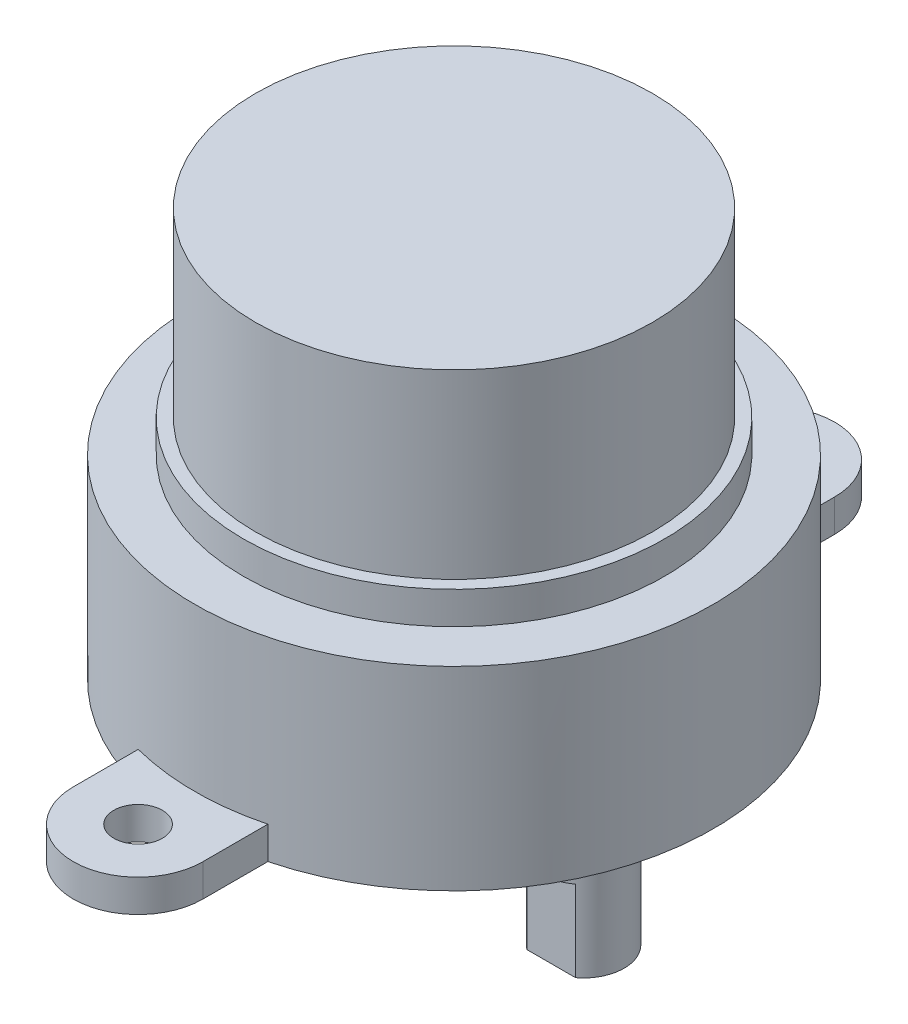
ISO-10303-21;
HEADER;
FILE_DESCRIPTION(('STEP AP214'),'2;1');
FILE_NAME('part.step','',(''),(''),'','','');
FILE_SCHEMA(('AUTOMOTIVE_DESIGN { 1 0 10303 214 1 1 1 1 }'));
ENDSEC;
DATA;
#1=APPLICATION_CONTEXT('core data for automotive mechanical design processes');
#2=APPLICATION_PROTOCOL_DEFINITION('international standard','automotive_design',2000,#1);
#3=PRODUCT_CONTEXT('',#1,'mechanical');
#4=PRODUCT('Part','Part','',(#3));
#5=PRODUCT_RELATED_PRODUCT_CATEGORY('part','',(#4));
#6=PRODUCT_DEFINITION_FORMATION('','',#4);
#7=PRODUCT_DEFINITION_CONTEXT('part definition',#1,'design');
#8=PRODUCT_DEFINITION('design','',#6,#7);
#9=PRODUCT_DEFINITION_SHAPE('','',#8);
#10=(LENGTH_UNIT() NAMED_UNIT(*) SI_UNIT(.MILLI.,.METRE.));
#11=(NAMED_UNIT(*) PLANE_ANGLE_UNIT() SI_UNIT($,.RADIAN.));
#12=(NAMED_UNIT(*) SI_UNIT($,.STERADIAN.) SOLID_ANGLE_UNIT());
#13=UNCERTAINTY_MEASURE_WITH_UNIT(LENGTH_MEASURE(1.E-05),#10,'distance_accuracy_value','');
#14=(GEOMETRIC_REPRESENTATION_CONTEXT(3) GLOBAL_UNCERTAINTY_ASSIGNED_CONTEXT((#13)) GLOBAL_UNIT_ASSIGNED_CONTEXT((#10,
#11,#12)) REPRESENTATION_CONTEXT('',''));
#15=CARTESIAN_POINT('',(0.,0.,0.));
#16=DIRECTION('',(0.,0.,1.));
#17=DIRECTION('',(1.,0.,0.));
#18=AXIS2_PLACEMENT_3D('',#15,#16,#17);
#19=CARTESIAN_POINT('',(8.,-10.2,0.));
#20=DIRECTION('',(0.,-1.,0.));
#21=DIRECTION('',(0.,0.,-1.));
#22=AXIS2_PLACEMENT_3D('',#19,#20,#21);
#23=CYLINDRICAL_SURFACE('',#22,2.5);
#24=CARTESIAN_POINT('',(8.,-2.7,0.));
#25=DIRECTION('',(0.,-1.,0.));
#26=DIRECTION('',(0.,0.,-1.));
#27=AXIS2_PLACEMENT_3D('',#24,#25,#26);
#28=CIRCLE('',#27,2.5);
#29=CARTESIAN_POINT('',(8.,-2.7,-2.5));
#30=VERTEX_POINT('',#29);
#31=EDGE_CURVE('E224',#30,#30,#28,.T.);
#32=ORIENTED_EDGE('',*,*,#31,.T.);
#33=EDGE_LOOP('',(#32));
#34=FACE_BOUND('',#33,.T.);
#35=DIRECTION('',(0.,-1.,0.));
#36=VECTOR('',#35,1.);
#37=CARTESIAN_POINT('',(6.5,-10.2,2.));
#38=LINE('',#37,#36);
#39=CARTESIAN_POINT('',(6.5,-10.2,2.));
#40=VERTEX_POINT('',#39);
#41=CARTESIAN_POINT('',(6.5,-5.2,2.));
#42=VERTEX_POINT('',#41);
#43=EDGE_CURVE('E189',#40,#42,#38,.F.);
#44=ORIENTED_EDGE('',*,*,#43,.T.);
#45=CARTESIAN_POINT('',(8.,-5.2,0.));
#46=DIRECTION('',(0.,1.,0.));
#47=DIRECTION('',(0.,0.,1.));
#48=AXIS2_PLACEMENT_3D('',#45,#46,#47);
#49=CIRCLE('',#48,2.5);
#50=CARTESIAN_POINT('',(9.5,-5.2,2.));
#51=VERTEX_POINT('',#50);
#52=EDGE_CURVE('E195',#51,#42,#49,.F.);
#53=ORIENTED_EDGE('',*,*,#52,.F.);
#54=DIRECTION('',(0.,-1.,0.));
#55=VECTOR('',#54,1.);
#56=CARTESIAN_POINT('',(9.5,-10.2,2.));
#57=LINE('',#56,#55);
#58=CARTESIAN_POINT('',(9.5,-10.2,2.));
#59=VERTEX_POINT('',#58);
#60=EDGE_CURVE('E186',#51,#59,#57,.T.);
#61=ORIENTED_EDGE('',*,*,#60,.T.);
#62=CARTESIAN_POINT('',(8.,-10.2,0.));
#63=DIRECTION('',(0.,-1.,0.));
#64=DIRECTION('',(0.,0.,-1.));
#65=AXIS2_PLACEMENT_3D('',#62,#63,#64);
#66=CIRCLE('',#65,2.5);
#67=CARTESIAN_POINT('',(9.5,-10.2,-2.));
#68=VERTEX_POINT('',#67);
#69=EDGE_CURVE('E221',#68,#59,#66,.T.);
#70=ORIENTED_EDGE('',*,*,#69,.F.);
#71=DIRECTION('',(0.,-1.,0.));
#72=VECTOR('',#71,1.);
#73=CARTESIAN_POINT('',(9.5,-10.2,-2.));
#74=LINE('',#73,#72);
#75=CARTESIAN_POINT('',(9.5,-5.2,-2.));
#76=VERTEX_POINT('',#75);
#77=EDGE_CURVE('E190',#76,#68,#74,.T.);
#78=ORIENTED_EDGE('',*,*,#77,.F.);
#79=CARTESIAN_POINT('',(8.,-5.2,0.));
#80=DIRECTION('',(0.,1.,0.));
#81=DIRECTION('',(0.,0.,1.));
#82=AXIS2_PLACEMENT_3D('',#79,#80,#81);
#83=CIRCLE('',#82,2.5);
#84=CARTESIAN_POINT('',(6.5,-5.2,-2.));
#85=VERTEX_POINT('',#84);
#86=EDGE_CURVE('E203',#85,#76,#83,.F.);
#87=ORIENTED_EDGE('',*,*,#86,.F.);
#88=DIRECTION('',(0.,-1.,0.));
#89=VECTOR('',#88,1.);
#90=CARTESIAN_POINT('',(6.5,-10.2,-2.));
#91=LINE('',#90,#89);
#92=CARTESIAN_POINT('',(6.5,-10.2,-2.));
#93=VERTEX_POINT('',#92);
#94=EDGE_CURVE('E208',#93,#85,#91,.F.);
#95=ORIENTED_EDGE('',*,*,#94,.F.);
#96=EDGE_CURVE('E220',#40,#93,#66,.T.);
#97=ORIENTED_EDGE('',*,*,#96,.F.);
#98=EDGE_LOOP('',(#44,#53,#61,#70,#78,#87,#95,#97));
#99=FACE_BOUND('',#98,.T.);
#100=ADVANCED_FACE('F42',(#34,#99),#23,.T.);
#101=CARTESIAN_POINT('',(5.5,-10.2,0.));
#102=DIRECTION('',(0.,1.,0.));
#103=DIRECTION('',(0.,0.,1.));
#104=AXIS2_PLACEMENT_3D('',#101,#102,#103);
#105=PLANE('',#104);
#106=CARTESIAN_POINT('',(8.,-10.2,0.));
#107=DIRECTION('',(0.,-1.,0.));
#108=DIRECTION('',(0.,0.,-1.));
#109=AXIS2_PLACEMENT_3D('',#106,#107,#108);
#110=CIRCLE('',#109,1.525);
#111=CARTESIAN_POINT('',(8.,-10.2,-1.525));
#112=VERTEX_POINT('',#111);
#113=EDGE_CURVE('E201',#112,#112,#110,.T.);
#114=ORIENTED_EDGE('',*,*,#113,.F.);
#115=EDGE_LOOP('',(#114));
#116=FACE_BOUND('',#115,.T.);
#117=DIRECTION('',(-1.,0.,0.));
#118=VECTOR('',#117,1.);
#119=CARTESIAN_POINT('',(3.28976687585963,-10.2,2.));
#120=LINE('',#119,#118);
#121=EDGE_CURVE('E198',#59,#40,#120,.T.);
#122=ORIENTED_EDGE('',*,*,#121,.T.);
#123=ORIENTED_EDGE('',*,*,#96,.T.);
#124=DIRECTION('',(-1.,0.,0.));
#125=VECTOR('',#124,1.);
#126=CARTESIAN_POINT('',(3.57834291760171,-10.2,-2.));
#127=LINE('',#126,#125);
#128=EDGE_CURVE('E181',#68,#93,#127,.T.);
#129=ORIENTED_EDGE('',*,*,#128,.F.);
#130=ORIENTED_EDGE('',*,*,#69,.T.);
#131=EDGE_LOOP('',(#122,#123,#129,#130));
#132=FACE_BOUND('',#131,.T.);
#133=ADVANCED_FACE('F294',(#116,#132),#105,.F.);
#134=CARTESIAN_POINT('',(-16.,0.,0.));
#135=DIRECTION('',(0.,1.,0.));
#136=DIRECTION('',(0.,0.,1.));
#137=AXIS2_PLACEMENT_3D('',#134,#135,#136);
#138=PLANE('',#137);
#139=CARTESIAN_POINT('',(8.,0.,0.));
#140=DIRECTION('',(0.,1.,0.));
#141=DIRECTION('',(0.,0.,1.));
#142=AXIS2_PLACEMENT_3D('',#139,#140,#141);
#143=CIRCLE('',#142,4.5);
#144=CARTESIAN_POINT('',(8.,0.,4.5));
#145=VERTEX_POINT('',#144);
#146=EDGE_CURVE('E254',#145,#145,#143,.F.);
#147=ORIENTED_EDGE('',*,*,#146,.F.);
#148=EDGE_LOOP('',(#147));
#149=FACE_BOUND('',#148,.T.);
#150=CARTESIAN_POINT('',(0.,0.,0.));
#151=DIRECTION('',(0.,-1.,0.));
#152=DIRECTION('',(0.,0.,-1.));
#153=AXIS2_PLACEMENT_3D('',#150,#151,#152);
#154=CIRCLE('',#153,16.);
#155=CARTESIAN_POINT('',(-4.,0.,15.4919333848297));
#156=VERTEX_POINT('',#155);
#157=CARTESIAN_POINT('',(-3.99999999999999,0.,-15.4919333848297));
#158=VERTEX_POINT('',#157);
#159=EDGE_CURVE('E236',#156,#158,#154,.T.);
#160=ORIENTED_EDGE('',*,*,#159,.T.);
#161=DIRECTION('',(0.,0.,-1.));
#162=VECTOR('',#161,1.);
#163=CARTESIAN_POINT('',(-4.,0.,19.5));
#164=LINE('',#163,#162);
#165=CARTESIAN_POINT('',(-3.99999999999999,0.,-19.5));
#166=VERTEX_POINT('',#165);
#167=EDGE_CURVE('E175',#158,#166,#164,.T.);
#168=ORIENTED_EDGE('',*,*,#167,.T.);
#169=CARTESIAN_POINT('',(0.,0.,-19.5));
#170=DIRECTION('',(0.,-1.,0.));
#171=DIRECTION('',(0.,0.,-1.));
#172=AXIS2_PLACEMENT_3D('',#169,#170,#171);
#173=CIRCLE('',#172,4.);
#174=CARTESIAN_POINT('',(4.00000000000001,0.,-19.5));
#175=VERTEX_POINT('',#174);
#176=EDGE_CURVE('E178',#166,#175,#173,.T.);
#177=ORIENTED_EDGE('',*,*,#176,.T.);
#178=DIRECTION('',(0.,0.,1.));
#179=VECTOR('',#178,1.);
#180=CARTESIAN_POINT('',(4.,0.,19.5));
#181=LINE('',#180,#179);
#182=CARTESIAN_POINT('',(4.00000000000001,0.,-15.4919333848297));
#183=VERTEX_POINT('',#182);
#184=EDGE_CURVE('E64',#175,#183,#181,.T.);
#185=ORIENTED_EDGE('',*,*,#184,.T.);
#186=CARTESIAN_POINT('',(4.,0.,15.4919333848297));
#187=VERTEX_POINT('',#186);
#188=EDGE_CURVE('E237',#183,#187,#154,.T.);
#189=ORIENTED_EDGE('',*,*,#188,.T.);
#190=CARTESIAN_POINT('',(4.,0.,19.5));
#191=VERTEX_POINT('',#190);
#192=EDGE_CURVE('E162',#187,#191,#181,.T.);
#193=ORIENTED_EDGE('',*,*,#192,.T.);
#194=CARTESIAN_POINT('',(0.,0.,19.5));
#195=DIRECTION('',(0.,-1.,0.));
#196=DIRECTION('',(0.,0.,-1.));
#197=AXIS2_PLACEMENT_3D('',#194,#195,#196);
#198=CIRCLE('',#197,4.);
#199=CARTESIAN_POINT('',(-4.,0.,19.5));
#200=VERTEX_POINT('',#199);
#201=EDGE_CURVE('E173',#191,#200,#198,.T.);
#202=ORIENTED_EDGE('',*,*,#201,.T.);
#203=EDGE_CURVE('E57',#200,#156,#164,.T.);
#204=ORIENTED_EDGE('',*,*,#203,.T.);
#205=EDGE_LOOP('',(#160,#168,#177,#185,#189,#193,#202,#204));
#206=FACE_BOUND('',#205,.T.);
#207=CARTESIAN_POINT('',(0.,0.,-19.5));
#208=DIRECTION('',(0.,-1.,0.));
#209=DIRECTION('',(0.,0.,-1.));
#210=AXIS2_PLACEMENT_3D('',#207,#208,#209);
#211=CIRCLE('',#210,1.5);
#212=CARTESIAN_POINT('',(0.,0.,-21.));
#213=VERTEX_POINT('',#212);
#214=EDGE_CURVE('E658',#213,#213,#211,.T.);
#215=ORIENTED_EDGE('',*,*,#214,.F.);
#216=EDGE_LOOP('',(#215));
#217=FACE_BOUND('',#216,.T.);
#218=CARTESIAN_POINT('',(0.,0.,19.5));
#219=DIRECTION('',(0.,-1.,0.));
#220=DIRECTION('',(0.,0.,-1.));
#221=AXIS2_PLACEMENT_3D('',#218,#219,#220);
#222=CIRCLE('',#221,1.5);
#223=CARTESIAN_POINT('',(0.,0.,18.));
#224=VERTEX_POINT('',#223);
#225=EDGE_CURVE('E165',#224,#224,#222,.T.);
#226=ORIENTED_EDGE('',*,*,#225,.F.);
#227=EDGE_LOOP('',(#226));
#228=FACE_BOUND('',#227,.T.);
#229=ADVANCED_FACE('F44',(#149,#206,#217,#228),#138,.F.);
#230=CARTESIAN_POINT('',(-12.25,25.2,0.));
#231=DIRECTION('',(0.,-1.,0.));
#232=DIRECTION('',(0.,0.,-1.));
#233=AXIS2_PLACEMENT_3D('',#230,#231,#232);
#234=PLANE('',#233);
#235=CARTESIAN_POINT('',(0.,25.2,0.));
#236=DIRECTION('',(0.,-1.,0.));
#237=DIRECTION('',(0.,0.,-1.));
#238=AXIS2_PLACEMENT_3D('',#235,#236,#237);
#239=CIRCLE('',#238,12.25);
#240=CARTESIAN_POINT('',(0.,25.2,-12.25));
#241=VERTEX_POINT('',#240);
#242=EDGE_CURVE('E251',#241,#241,#239,.T.);
#243=ORIENTED_EDGE('',*,*,#242,.F.);
#244=EDGE_LOOP('',(#243));
#245=FACE_BOUND('',#244,.T.);
#246=ADVANCED_FACE('F338',(#245),#234,.F.);
#247=CARTESIAN_POINT('',(0.,0.,0.));
#248=DIRECTION('',(0.,-1.,0.));
#249=DIRECTION('',(0.,0.,-1.));
#250=AXIS2_PLACEMENT_3D('',#247,#248,#249);
#251=CYLINDRICAL_SURFACE('',#250,12.25);
#252=CARTESIAN_POINT('',(0.,14.,0.));
#253=DIRECTION('',(0.,-1.,0.));
#254=DIRECTION('',(0.,0.,-1.));
#255=AXIS2_PLACEMENT_3D('',#252,#253,#254);
#256=CIRCLE('',#255,12.25);
#257=CARTESIAN_POINT('',(0.,14.,-12.25));
#258=VERTEX_POINT('',#257);
#259=EDGE_CURVE('E248',#258,#258,#256,.T.);
#260=ORIENTED_EDGE('',*,*,#259,.F.);
#261=EDGE_LOOP('',(#260));
#262=FACE_BOUND('',#261,.T.);
#263=ORIENTED_EDGE('',*,*,#242,.T.);
#264=EDGE_LOOP('',(#263));
#265=FACE_BOUND('',#264,.T.);
#266=ADVANCED_FACE('F335',(#262,#265),#251,.T.);
#267=CARTESIAN_POINT('',(-13.,14.,0.));
#268=DIRECTION('',(0.,-1.,0.));
#269=DIRECTION('',(0.,0.,-1.));
#270=AXIS2_PLACEMENT_3D('',#267,#268,#269);
#271=PLANE('',#270);
#272=CARTESIAN_POINT('',(0.,14.,0.));
#273=DIRECTION('',(0.,-1.,0.));
#274=DIRECTION('',(0.,0.,-1.));
#275=AXIS2_PLACEMENT_3D('',#272,#273,#274);
#276=CIRCLE('',#275,13.);
#277=CARTESIAN_POINT('',(0.,14.,-13.));
#278=VERTEX_POINT('',#277);
#279=EDGE_CURVE('E245',#278,#278,#276,.T.);
#280=ORIENTED_EDGE('',*,*,#279,.F.);
#281=EDGE_LOOP('',(#280));
#282=FACE_BOUND('',#281,.T.);
#283=ORIENTED_EDGE('',*,*,#259,.T.);
#284=EDGE_LOOP('',(#283));
#285=FACE_BOUND('',#284,.T.);
#286=ADVANCED_FACE('F331',(#282,#285),#271,.F.);
#287=CARTESIAN_POINT('',(0.,0.,0.));
#288=DIRECTION('',(0.,-1.,0.));
#289=DIRECTION('',(0.,0.,-1.));
#290=AXIS2_PLACEMENT_3D('',#287,#288,#289);
#291=CYLINDRICAL_SURFACE('',#290,13.);
#292=CARTESIAN_POINT('',(0.,12.,0.));
#293=DIRECTION('',(0.,-1.,0.));
#294=DIRECTION('',(0.,0.,-1.));
#295=AXIS2_PLACEMENT_3D('',#292,#293,#294);
#296=CIRCLE('',#295,13.);
#297=CARTESIAN_POINT('',(0.,12.,-13.));
#298=VERTEX_POINT('',#297);
#299=EDGE_CURVE('E242',#298,#298,#296,.T.);
#300=ORIENTED_EDGE('',*,*,#299,.F.);
#301=EDGE_LOOP('',(#300));
#302=FACE_BOUND('',#301,.T.);
#303=ORIENTED_EDGE('',*,*,#279,.T.);
#304=EDGE_LOOP('',(#303));
#305=FACE_BOUND('',#304,.T.);
#306=ADVANCED_FACE('F327',(#302,#305),#291,.T.);
#307=CARTESIAN_POINT('',(-16.,12.,0.));
#308=DIRECTION('',(0.,-1.,0.));
#309=DIRECTION('',(0.,0.,-1.));
#310=AXIS2_PLACEMENT_3D('',#307,#308,#309);
#311=PLANE('',#310);
#312=CARTESIAN_POINT('',(0.,12.,0.));
#313=DIRECTION('',(0.,-1.,0.));
#314=DIRECTION('',(0.,0.,-1.));
#315=AXIS2_PLACEMENT_3D('',#312,#313,#314);
#316=CIRCLE('',#315,16.);
#317=CARTESIAN_POINT('',(0.,12.,-16.));
#318=VERTEX_POINT('',#317);
#319=EDGE_CURVE('E239',#318,#318,#316,.T.);
#320=ORIENTED_EDGE('',*,*,#319,.F.);
#321=EDGE_LOOP('',(#320));
#322=FACE_BOUND('',#321,.T.);
#323=ORIENTED_EDGE('',*,*,#299,.T.);
#324=EDGE_LOOP('',(#323));
#325=FACE_BOUND('',#324,.T.);
#326=ADVANCED_FACE('F324',(#322,#325),#311,.F.);
#327=CARTESIAN_POINT('',(0.,0.,0.));
#328=DIRECTION('',(0.,-1.,0.));
#329=DIRECTION('',(0.,0.,-1.));
#330=AXIS2_PLACEMENT_3D('',#327,#328,#329);
#331=CYLINDRICAL_SURFACE('',#330,16.);
#332=CARTESIAN_POINT('',(0.,2.,0.));
#333=DIRECTION('',(0.,-1.,0.));
#334=DIRECTION('',(0.,0.,-1.));
#335=AXIS2_PLACEMENT_3D('',#332,#333,#334);
#336=CIRCLE('',#335,16.);
#337=CARTESIAN_POINT('',(4.,2.,15.4919333848297));
#338=VERTEX_POINT('',#337);
#339=CARTESIAN_POINT('',(-4.,2.,15.4919333848297));
#340=VERTEX_POINT('',#339);
#341=EDGE_CURVE('E153',#338,#340,#336,.T.);
#342=ORIENTED_EDGE('',*,*,#341,.F.);
#343=DIRECTION('',(0.,-1.,0.));
#344=VECTOR('',#343,1.);
#345=CARTESIAN_POINT('',(4.,0.,15.4919333848297));
#346=LINE('',#345,#344);
#347=EDGE_CURVE('E11',#338,#187,#346,.T.);
#348=ORIENTED_EDGE('',*,*,#347,.T.);
#349=ORIENTED_EDGE('',*,*,#188,.F.);
#350=DIRECTION('',(0.,-1.,0.));
#351=VECTOR('',#350,1.);
#352=CARTESIAN_POINT('',(4.00000000000001,0.,-15.4919333848297));
#353=LINE('',#352,#351);
#354=CARTESIAN_POINT('',(4.00000000000001,2.,-15.4919333848297));
#355=VERTEX_POINT('',#354);
#356=EDGE_CURVE('E262',#183,#355,#353,.F.);
#357=ORIENTED_EDGE('',*,*,#356,.T.);
#358=CARTESIAN_POINT('',(-3.99999999999999,2.,-15.4919333848297));
#359=VERTEX_POINT('',#358);
#360=EDGE_CURVE('E257',#359,#355,#336,.T.);
#361=ORIENTED_EDGE('',*,*,#360,.F.);
#362=DIRECTION('',(0.,-1.,0.));
#363=VECTOR('',#362,1.);
#364=CARTESIAN_POINT('',(-3.99999999999999,0.,-15.4919333848297));
#365=LINE('',#364,#363);
#366=EDGE_CURVE('E259',#359,#158,#365,.T.);
#367=ORIENTED_EDGE('',*,*,#366,.T.);
#368=ORIENTED_EDGE('',*,*,#159,.F.);
#369=DIRECTION('',(0.,-1.,0.));
#370=VECTOR('',#369,1.);
#371=CARTESIAN_POINT('',(-4.,0.,15.4919333848297));
#372=LINE('',#371,#370);
#373=EDGE_CURVE('E50',#156,#340,#372,.F.);
#374=ORIENTED_EDGE('',*,*,#373,.T.);
#375=EDGE_LOOP('',(#342,#348,#349,#357,#361,#367,#368,#374));
#376=FACE_BOUND('',#375,.T.);
#377=ORIENTED_EDGE('',*,*,#319,.T.);
#378=EDGE_LOOP('',(#377));
#379=FACE_BOUND('',#378,.T.);
#380=ADVANCED_FACE('F266',(#376,#379),#331,.T.);
#381=CARTESIAN_POINT('',(8.,-10.2,0.));
#382=DIRECTION('',(0.,-1.,0.));
#383=DIRECTION('',(0.,0.,-1.));
#384=AXIS2_PLACEMENT_3D('',#381,#382,#383);
#385=CYLINDRICAL_SURFACE('',#384,4.5);
#386=CARTESIAN_POINT('',(8.,-1.25,0.));
#387=DIRECTION('',(0.,-1.,0.));
#388=DIRECTION('',(0.,0.,-1.));
#389=AXIS2_PLACEMENT_3D('',#386,#387,#388);
#390=CIRCLE('',#389,4.5);
#391=CARTESIAN_POINT('',(8.,-1.25,-4.5));
#392=VERTEX_POINT('',#391);
#393=EDGE_CURVE('E233',#392,#392,#390,.T.);
#394=ORIENTED_EDGE('',*,*,#393,.F.);
#395=EDGE_LOOP('',(#394));
#396=FACE_BOUND('',#395,.T.);
#397=ORIENTED_EDGE('',*,*,#146,.T.);
#398=EDGE_LOOP('',(#397));
#399=FACE_BOUND('',#398,.T.);
#400=ADVANCED_FACE('F317',(#396,#399),#385,.T.);
#401=CARTESIAN_POINT('',(3.5,-1.25,0.));
#402=DIRECTION('',(0.,1.,0.));
#403=DIRECTION('',(0.,0.,1.));
#404=AXIS2_PLACEMENT_3D('',#401,#402,#403);
#405=PLANE('',#404);
#406=CARTESIAN_POINT('',(8.,-1.25,0.));
#407=DIRECTION('',(0.,-1.,0.));
#408=DIRECTION('',(0.,0.,-1.));
#409=AXIS2_PLACEMENT_3D('',#406,#407,#408);
#410=CIRCLE('',#409,4.);
#411=CARTESIAN_POINT('',(8.,-1.25,-4.));
#412=VERTEX_POINT('',#411);
#413=EDGE_CURVE('E230',#412,#412,#410,.T.);
#414=ORIENTED_EDGE('',*,*,#413,.F.);
#415=EDGE_LOOP('',(#414));
#416=FACE_BOUND('',#415,.T.);
#417=ORIENTED_EDGE('',*,*,#393,.T.);
#418=EDGE_LOOP('',(#417));
#419=FACE_BOUND('',#418,.T.);
#420=ADVANCED_FACE('F313',(#416,#419),#405,.F.);
#421=CARTESIAN_POINT('',(8.,-10.2,0.));
#422=DIRECTION('',(0.,-1.,0.));
#423=DIRECTION('',(0.,0.,-1.));
#424=AXIS2_PLACEMENT_3D('',#421,#422,#423);
#425=CYLINDRICAL_SURFACE('',#424,4.);
#426=CARTESIAN_POINT('',(8.,-2.7,0.));
#427=DIRECTION('',(0.,-1.,0.));
#428=DIRECTION('',(0.,0.,-1.));
#429=AXIS2_PLACEMENT_3D('',#426,#427,#428);
#430=CIRCLE('',#429,4.);
#431=CARTESIAN_POINT('',(8.,-2.7,-4.));
#432=VERTEX_POINT('',#431);
#433=EDGE_CURVE('E227',#432,#432,#430,.T.);
#434=ORIENTED_EDGE('',*,*,#433,.F.);
#435=EDGE_LOOP('',(#434));
#436=FACE_BOUND('',#435,.T.);
#437=ORIENTED_EDGE('',*,*,#413,.T.);
#438=EDGE_LOOP('',(#437));
#439=FACE_BOUND('',#438,.T.);
#440=ADVANCED_FACE('F309',(#436,#439),#425,.T.);
#441=CARTESIAN_POINT('',(4.,-2.7,0.));
#442=DIRECTION('',(0.,1.,0.));
#443=DIRECTION('',(0.,0.,1.));
#444=AXIS2_PLACEMENT_3D('',#441,#442,#443);
#445=PLANE('',#444);
#446=ORIENTED_EDGE('',*,*,#31,.F.);
#447=EDGE_LOOP('',(#446));
#448=FACE_BOUND('',#447,.T.);
#449=ORIENTED_EDGE('',*,*,#433,.T.);
#450=EDGE_LOOP('',(#449));
#451=FACE_BOUND('',#450,.T.);
#452=ADVANCED_FACE('F305',(#448,#451),#445,.F.);
#453=CARTESIAN_POINT('',(8.,-2.7,0.));
#454=DIRECTION('',(0.,-1.,0.));
#455=DIRECTION('',(0.,0.,-1.));
#456=AXIS2_PLACEMENT_3D('',#453,#454,#455);
#457=CONICAL_SURFACE('',#456,1.25,1.02974425867665);
#458=CARTESIAN_POINT('',(8.,-1.94892422621555,0.));
#459=VERTEX_POINT('',#458);
#460=VERTEX_LOOP('',#459);
#461=FACE_BOUND('',#460,.T.);
#462=CARTESIAN_POINT('',(8.,-2.7,0.));
#463=DIRECTION('',(0.,-1.,0.));
#464=DIRECTION('',(0.,0.,-1.));
#465=AXIS2_PLACEMENT_3D('',#462,#463,#464);
#466=CIRCLE('',#465,1.25);
#467=CARTESIAN_POINT('',(8.,-2.7,-1.25));
#468=VERTEX_POINT('',#467);
#469=EDGE_CURVE('E217',#468,#468,#466,.T.);
#470=ORIENTED_EDGE('',*,*,#469,.T.);
#471=EDGE_LOOP('',(#470));
#472=FACE_BOUND('',#471,.T.);
#473=ADVANCED_FACE('F308',(#461,#472),#457,.F.);
#474=CARTESIAN_POINT('',(8.,-10.2,0.));
#475=DIRECTION('',(0.,-1.,0.));
#476=DIRECTION('',(0.,0.,-1.));
#477=AXIS2_PLACEMENT_3D('',#474,#475,#476);
#478=CYLINDRICAL_SURFACE('',#477,1.25);
#479=ORIENTED_EDGE('',*,*,#469,.F.);
#480=EDGE_LOOP('',(#479));
#481=FACE_BOUND('',#480,.T.);
#482=CARTESIAN_POINT('',(8.,-9.925,0.));
#483=DIRECTION('',(0.,-1.,0.));
#484=DIRECTION('',(0.,0.,-1.));
#485=AXIS2_PLACEMENT_3D('',#482,#483,#484);
#486=CIRCLE('',#485,1.25);
#487=CARTESIAN_POINT('',(8.,-9.925,-1.25));
#488=VERTEX_POINT('',#487);
#489=EDGE_CURVE('E214',#488,#488,#486,.T.);
#490=ORIENTED_EDGE('',*,*,#489,.T.);
#491=EDGE_LOOP('',(#490));
#492=FACE_BOUND('',#491,.T.);
#493=ADVANCED_FACE('F521',(#481,#492),#478,.F.);
#494=CARTESIAN_POINT('',(8.,-10.2,0.));
#495=DIRECTION('',(0.,-1.,0.));
#496=DIRECTION('',(0.,0.,-1.));
#497=AXIS2_PLACEMENT_3D('',#494,#495,#496);
#498=CONICAL_SURFACE('',#497,1.525,0.785398163397445);
#499=ORIENTED_EDGE('',*,*,#489,.F.);
#500=EDGE_LOOP('',(#499));
#501=FACE_BOUND('',#500,.T.);
#502=ORIENTED_EDGE('',*,*,#113,.T.);
#503=EDGE_LOOP('',(#502));
#504=FACE_BOUND('',#503,.T.);
#505=ADVANCED_FACE('F373',(#501,#504),#498,.F.);
#506=CARTESIAN_POINT('',(3.57834291760171,-10.201,-2.));
#507=DIRECTION('',(0.,0.,1.));
#508=DIRECTION('',(1.,0.,0.));
#509=AXIS2_PLACEMENT_3D('',#506,#507,#508);
#510=PLANE('',#509);
#511=ORIENTED_EDGE('',*,*,#94,.T.);
#512=DIRECTION('',(1.,0.,0.));
#513=VECTOR('',#512,1.);
#514=CARTESIAN_POINT('',(3.57834291760171,-5.2,-2.));
#515=LINE('',#514,#513);
#516=EDGE_CURVE('E206',#85,#76,#515,.T.);
#517=ORIENTED_EDGE('',*,*,#516,.T.);
#518=ORIENTED_EDGE('',*,*,#77,.T.);
#519=ORIENTED_EDGE('',*,*,#128,.T.);
#520=EDGE_LOOP('',(#511,#517,#518,#519));
#521=FACE_BOUND('',#520,.T.);
#522=ADVANCED_FACE('F367',(#521),#510,.F.);
#523=CARTESIAN_POINT('',(0.,-5.2,0.));
#524=DIRECTION('',(0.,1.,0.));
#525=DIRECTION('',(0.,0.,1.));
#526=AXIS2_PLACEMENT_3D('',#523,#524,#525);
#527=PLANE('',#526);
#528=ORIENTED_EDGE('',*,*,#86,.T.);
#529=ORIENTED_EDGE('',*,*,#516,.F.);
#530=EDGE_LOOP('',(#528,#529));
#531=FACE_BOUND('',#530,.T.);
#532=ADVANCED_FACE('F372',(#531),#527,.F.);
#533=CARTESIAN_POINT('',(3.28976687585963,-10.201,2.));
#534=DIRECTION('',(0.,0.,1.));
#535=DIRECTION('',(1.,0.,0.));
#536=AXIS2_PLACEMENT_3D('',#533,#534,#535);
#537=PLANE('',#536);
#538=ORIENTED_EDGE('',*,*,#121,.F.);
#539=ORIENTED_EDGE('',*,*,#60,.F.);
#540=DIRECTION('',(1.,0.,0.));
#541=VECTOR('',#540,1.);
#542=CARTESIAN_POINT('',(3.28976687585963,-5.2,2.));
#543=LINE('',#542,#541);
#544=EDGE_CURVE('E193',#42,#51,#543,.T.);
#545=ORIENTED_EDGE('',*,*,#544,.F.);
#546=ORIENTED_EDGE('',*,*,#43,.F.);
#547=EDGE_LOOP('',(#538,#539,#545,#546));
#548=FACE_BOUND('',#547,.T.);
#549=ADVANCED_FACE('F386',(#548),#537,.T.);
#550=CARTESIAN_POINT('',(0.,-5.2,0.));
#551=DIRECTION('',(0.,1.,0.));
#552=DIRECTION('',(0.,0.,1.));
#553=AXIS2_PLACEMENT_3D('',#550,#551,#552);
#554=PLANE('',#553);
#555=ORIENTED_EDGE('',*,*,#52,.T.);
#556=ORIENTED_EDGE('',*,*,#544,.T.);
#557=EDGE_LOOP('',(#555,#556));
#558=FACE_BOUND('',#557,.T.);
#559=ADVANCED_FACE('F396',(#558),#554,.F.);
#560=CARTESIAN_POINT('',(0.,2.,-19.5));
#561=DIRECTION('',(0.,-1.,0.));
#562=DIRECTION('',(0.,0.,-1.));
#563=AXIS2_PLACEMENT_3D('',#560,#561,#562);
#564=CYLINDRICAL_SURFACE('',#563,1.5);
#565=CARTESIAN_POINT('',(0.,2.,-19.5));
#566=DIRECTION('',(0.,-1.,0.));
#567=DIRECTION('',(0.,0.,-1.));
#568=AXIS2_PLACEMENT_3D('',#565,#566,#567);
#569=CIRCLE('',#568,1.5);
#570=CARTESIAN_POINT('',(0.,2.,-21.));
#571=VERTEX_POINT('',#570);
#572=EDGE_CURVE('E656',#571,#571,#569,.T.);
#573=ORIENTED_EDGE('',*,*,#572,.F.);
#574=EDGE_LOOP('',(#573));
#575=FACE_BOUND('',#574,.T.);
#576=ORIENTED_EDGE('',*,*,#214,.T.);
#577=EDGE_LOOP('',(#576));
#578=FACE_BOUND('',#577,.T.);
#579=ADVANCED_FACE('F406',(#575,#578),#564,.F.);
#580=CARTESIAN_POINT('',(0.,2.,-19.5));
#581=DIRECTION('',(0.,-1.,0.));
#582=DIRECTION('',(0.,0.,-1.));
#583=AXIS2_PLACEMENT_3D('',#580,#581,#582);
#584=CYLINDRICAL_SURFACE('',#583,4.);
#585=ORIENTED_EDGE('',*,*,#176,.F.);
#586=DIRECTION('',(0.,-1.,0.));
#587=VECTOR('',#586,1.);
#588=CARTESIAN_POINT('',(-3.99999999999999,2.,-19.5));
#589=LINE('',#588,#587);
#590=CARTESIAN_POINT('',(-3.99999999999999,2.,-19.5));
#591=VERTEX_POINT('',#590);
#592=EDGE_CURVE('E144',#591,#166,#589,.T.);
#593=ORIENTED_EDGE('',*,*,#592,.F.);
#594=CARTESIAN_POINT('',(0.,2.,-19.5));
#595=DIRECTION('',(0.,-1.,0.));
#596=DIRECTION('',(0.,0.,-1.));
#597=AXIS2_PLACEMENT_3D('',#594,#595,#596);
#598=CIRCLE('',#597,4.);
#599=CARTESIAN_POINT('',(4.00000000000001,2.,-19.5));
#600=VERTEX_POINT('',#599);
#601=EDGE_CURVE('E154',#591,#600,#598,.T.);
#602=ORIENTED_EDGE('',*,*,#601,.T.);
#603=DIRECTION('',(0.,-1.,0.));
#604=VECTOR('',#603,1.);
#605=CARTESIAN_POINT('',(4.00000000000001,2.,-19.5));
#606=LINE('',#605,#604);
#607=EDGE_CURVE('E182',#600,#175,#606,.T.);
#608=ORIENTED_EDGE('',*,*,#607,.T.);
#609=EDGE_LOOP('',(#585,#593,#602,#608));
#610=FACE_BOUND('',#609,.T.);
#611=ADVANCED_FACE('F277',(#610),#584,.T.);
#612=CARTESIAN_POINT('',(0.,2.,19.5));
#613=DIRECTION('',(0.,-1.,0.));
#614=DIRECTION('',(0.,0.,-1.));
#615=AXIS2_PLACEMENT_3D('',#612,#613,#614);
#616=PLANE('',#615);
#617=ORIENTED_EDGE('',*,*,#572,.T.);
#618=EDGE_LOOP('',(#617));
#619=FACE_BOUND('',#618,.T.);
#620=DIRECTION('',(0.,0.,-1.));
#621=VECTOR('',#620,1.);
#622=CARTESIAN_POINT('',(-4.,2.,19.5));
#623=LINE('',#622,#621);
#624=EDGE_CURVE('E155',#359,#591,#623,.T.);
#625=ORIENTED_EDGE('',*,*,#624,.F.);
#626=ORIENTED_EDGE('',*,*,#360,.T.);
#627=DIRECTION('',(0.,0.,1.));
#628=VECTOR('',#627,1.);
#629=CARTESIAN_POINT('',(4.,2.,19.5));
#630=LINE('',#629,#628);
#631=EDGE_CURVE('E145',#600,#355,#630,.T.);
#632=ORIENTED_EDGE('',*,*,#631,.F.);
#633=ORIENTED_EDGE('',*,*,#601,.F.);
#634=EDGE_LOOP('',(#625,#626,#632,#633));
#635=FACE_BOUND('',#634,.T.);
#636=ADVANCED_FACE('F425',(#619,#635),#616,.F.);
#637=CARTESIAN_POINT('',(-4.,2.,19.5));
#638=DIRECTION('',(-1.,0.,0.));
#639=DIRECTION('',(0.,0.,1.));
#640=AXIS2_PLACEMENT_3D('',#637,#638,#639);
#641=PLANE('',#640);
#642=ORIENTED_EDGE('',*,*,#366,.F.);
#643=ORIENTED_EDGE('',*,*,#624,.T.);
#644=ORIENTED_EDGE('',*,*,#592,.T.);
#645=ORIENTED_EDGE('',*,*,#167,.F.);
#646=EDGE_LOOP('',(#642,#643,#644,#645));
#647=FACE_BOUND('',#646,.T.);
#648=ADVANCED_FACE('F273',(#647),#641,.T.);
#649=CARTESIAN_POINT('',(4.,2.,19.5));
#650=DIRECTION('',(1.,0.,0.));
#651=DIRECTION('',(0.,0.,-1.));
#652=AXIS2_PLACEMENT_3D('',#649,#650,#651);
#653=PLANE('',#652);
#654=ORIENTED_EDGE('',*,*,#356,.F.);
#655=ORIENTED_EDGE('',*,*,#184,.F.);
#656=ORIENTED_EDGE('',*,*,#607,.F.);
#657=ORIENTED_EDGE('',*,*,#631,.T.);
#658=EDGE_LOOP('',(#654,#655,#656,#657));
#659=FACE_BOUND('',#658,.T.);
#660=ADVANCED_FACE('F280',(#659),#653,.T.);
#661=ORIENTED_EDGE('',*,*,#347,.F.);
#662=CARTESIAN_POINT('',(4.,2.,19.5));
#663=VERTEX_POINT('',#662);
#664=EDGE_CURVE('E170',#338,#663,#630,.T.);
#665=ORIENTED_EDGE('',*,*,#664,.T.);
#666=DIRECTION('',(0.,-1.,0.));
#667=VECTOR('',#666,1.);
#668=CARTESIAN_POINT('',(4.,2.,19.5));
#669=LINE('',#668,#667);
#670=EDGE_CURVE('E160',#663,#191,#669,.T.);
#671=ORIENTED_EDGE('',*,*,#670,.T.);
#672=ORIENTED_EDGE('',*,*,#192,.F.);
#673=EDGE_LOOP('',(#661,#665,#671,#672));
#674=FACE_BOUND('',#673,.T.);
#675=ADVANCED_FACE('F283',(#674),#653,.T.);
#676=ORIENTED_EDGE('',*,*,#373,.F.);
#677=ORIENTED_EDGE('',*,*,#203,.F.);
#678=DIRECTION('',(0.,-1.,0.));
#679=VECTOR('',#678,1.);
#680=CARTESIAN_POINT('',(-4.,2.,19.5));
#681=LINE('',#680,#679);
#682=CARTESIAN_POINT('',(-4.,2.,19.5));
#683=VERTEX_POINT('',#682);
#684=EDGE_CURVE('E136',#683,#200,#681,.T.);
#685=ORIENTED_EDGE('',*,*,#684,.F.);
#686=EDGE_CURVE('E139',#683,#340,#623,.T.);
#687=ORIENTED_EDGE('',*,*,#686,.T.);
#688=EDGE_LOOP('',(#676,#677,#685,#687));
#689=FACE_BOUND('',#688,.T.);
#690=ADVANCED_FACE('F138',(#689),#641,.T.);
#691=CARTESIAN_POINT('',(0.,2.,19.5));
#692=DIRECTION('',(0.,-1.,0.));
#693=DIRECTION('',(0.,0.,-1.));
#694=AXIS2_PLACEMENT_3D('',#691,#692,#693);
#695=CIRCLE('',#694,1.5);
#696=CARTESIAN_POINT('',(0.,2.,18.));
#697=VERTEX_POINT('',#696);
#698=EDGE_CURVE('E176',#697,#697,#695,.T.);
#699=ORIENTED_EDGE('',*,*,#698,.T.);
#700=EDGE_LOOP('',(#699));
#701=FACE_BOUND('',#700,.T.);
#702=ORIENTED_EDGE('',*,*,#664,.F.);
#703=ORIENTED_EDGE('',*,*,#341,.T.);
#704=ORIENTED_EDGE('',*,*,#686,.F.);
#705=CARTESIAN_POINT('',(0.,2.,19.5));
#706=DIRECTION('',(0.,-1.,0.));
#707=DIRECTION('',(0.,0.,-1.));
#708=AXIS2_PLACEMENT_3D('',#705,#706,#707);
#709=CIRCLE('',#708,4.);
#710=EDGE_CURVE('E151',#663,#683,#709,.T.);
#711=ORIENTED_EDGE('',*,*,#710,.F.);
#712=EDGE_LOOP('',(#702,#703,#704,#711));
#713=FACE_BOUND('',#712,.T.);
#714=ADVANCED_FACE('F150',(#701,#713),#616,.F.);
#715=CARTESIAN_POINT('',(0.,2.,19.5));
#716=DIRECTION('',(0.,-1.,0.));
#717=DIRECTION('',(0.,0.,-1.));
#718=AXIS2_PLACEMENT_3D('',#715,#716,#717);
#719=CYLINDRICAL_SURFACE('',#718,4.);
#720=ORIENTED_EDGE('',*,*,#201,.F.);
#721=ORIENTED_EDGE('',*,*,#670,.F.);
#722=ORIENTED_EDGE('',*,*,#710,.T.);
#723=ORIENTED_EDGE('',*,*,#684,.T.);
#724=EDGE_LOOP('',(#720,#721,#722,#723));
#725=FACE_BOUND('',#724,.T.);
#726=ADVANCED_FACE('F158',(#725),#719,.T.);
#727=CARTESIAN_POINT('',(0.,2.,19.5));
#728=DIRECTION('',(0.,-1.,0.));
#729=DIRECTION('',(0.,0.,-1.));
#730=AXIS2_PLACEMENT_3D('',#727,#728,#729);
#731=CYLINDRICAL_SURFACE('',#730,1.5);
#732=ORIENTED_EDGE('',*,*,#698,.F.);
#733=EDGE_LOOP('',(#732));
#734=FACE_BOUND('',#733,.T.);
#735=ORIENTED_EDGE('',*,*,#225,.T.);
#736=EDGE_LOOP('',(#735));
#737=FACE_BOUND('',#736,.T.);
#738=ADVANCED_FACE('F471',(#734,#737),#731,.F.);
#739=CLOSED_SHELL('',(#100,#133,#229,#246,#266,#286,#306,#326,#380,#400,#420,#440,#452,#473,
#493,#505,#522,#532,#549,#559,#579,#611,#636,#648,#660,#675,#690,#714,#726,#738));
#740=MANIFOLD_SOLID_BREP('B2',#739);
#741=ADVANCED_BREP_SHAPE_REPRESENTATION('',(#18,#740),#14);
#742=SHAPE_DEFINITION_REPRESENTATION(#9,#741);
ENDSEC;
END-ISO-10303-21;
